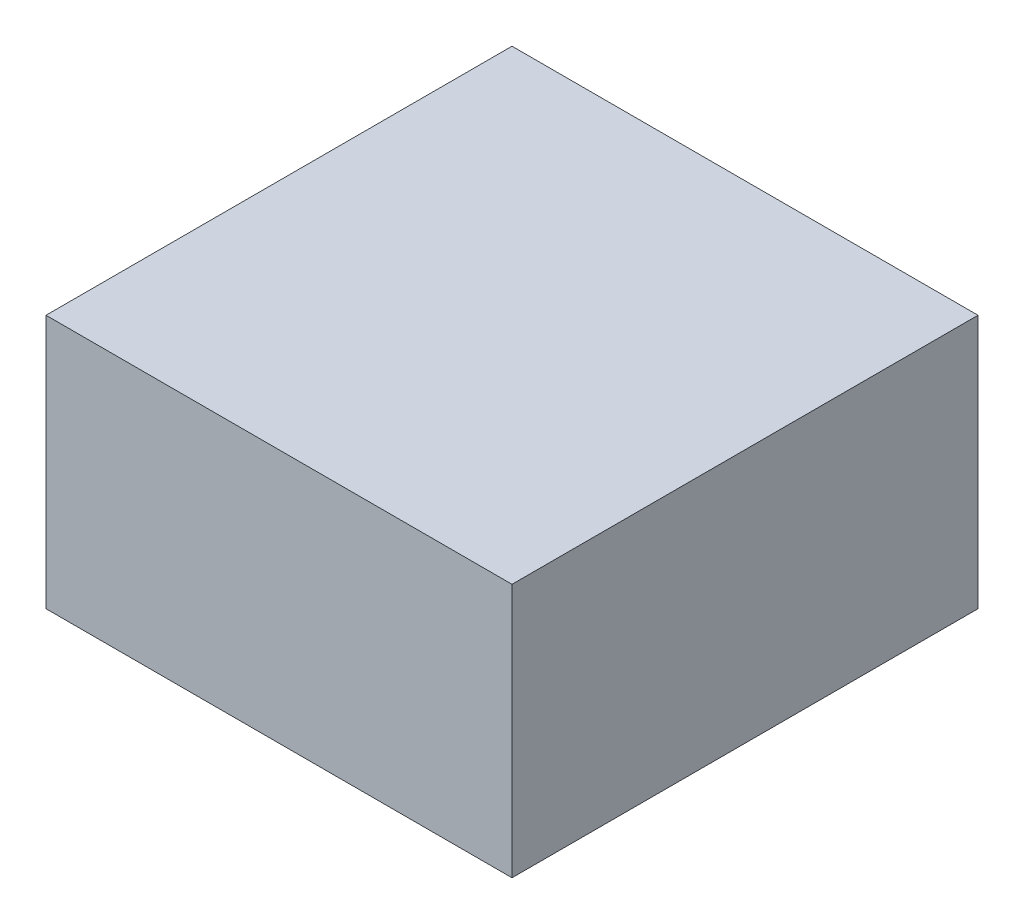
ISO-10303-21;
HEADER;
FILE_DESCRIPTION(('STEP AP214'),'2;1');
FILE_NAME('part.step','',(''),(''),'','','');
FILE_SCHEMA(('AUTOMOTIVE_DESIGN { 1 0 10303 214 1 1 1 1 }'));
ENDSEC;
DATA;
#1=APPLICATION_CONTEXT('core data for automotive mechanical design processes');
#2=APPLICATION_PROTOCOL_DEFINITION('international standard','automotive_design',2000,#1);
#3=PRODUCT_CONTEXT('',#1,'mechanical');
#4=PRODUCT('Part','Part','',(#3));
#5=PRODUCT_RELATED_PRODUCT_CATEGORY('part','',(#4));
#6=PRODUCT_DEFINITION_FORMATION('','',#4);
#7=PRODUCT_DEFINITION_CONTEXT('part definition',#1,'design');
#8=PRODUCT_DEFINITION('design','',#6,#7);
#9=PRODUCT_DEFINITION_SHAPE('','',#8);
#10=(LENGTH_UNIT() NAMED_UNIT(*) SI_UNIT(.MILLI.,.METRE.));
#11=(NAMED_UNIT(*) PLANE_ANGLE_UNIT() SI_UNIT($,.RADIAN.));
#12=(NAMED_UNIT(*) SI_UNIT($,.STERADIAN.) SOLID_ANGLE_UNIT());
#13=UNCERTAINTY_MEASURE_WITH_UNIT(LENGTH_MEASURE(1.E-05),#10,'distance_accuracy_value','');
#14=(GEOMETRIC_REPRESENTATION_CONTEXT(3) GLOBAL_UNCERTAINTY_ASSIGNED_CONTEXT((#13)) GLOBAL_UNIT_ASSIGNED_CONTEXT((#10,
#11,#12)) REPRESENTATION_CONTEXT('',''));
#15=CARTESIAN_POINT('',(0.,0.,0.));
#16=DIRECTION('',(0.,0.,1.));
#17=DIRECTION('',(1.,0.,0.));
#18=AXIS2_PLACEMENT_3D('',#15,#16,#17);
#19=CARTESIAN_POINT('',(0.,-120.,0.));
#20=DIRECTION('',(-1.,0.,0.));
#21=DIRECTION('',(0.,0.,1.));
#22=AXIS2_PLACEMENT_3D('',#19,#20,#21);
#23=PLANE('',#22);
#24=DIRECTION('',(0.,0.,1.));
#25=VECTOR('',#24,1.);
#26=CARTESIAN_POINT('',(0.,0.,0.));
#27=LINE('',#26,#25);
#28=CARTESIAN_POINT('',(0.,0.,-220.));
#29=VERTEX_POINT('',#28);
#30=CARTESIAN_POINT('',(0.,0.,0.));
#31=VERTEX_POINT('',#30);
#32=EDGE_CURVE('E97',#29,#31,#27,.T.);
#33=ORIENTED_EDGE('',*,*,#32,.F.);
#34=DIRECTION('',(0.,1.,0.));
#35=VECTOR('',#34,1.);
#36=CARTESIAN_POINT('',(0.,-120.,-220.));
#37=LINE('',#36,#35);
#38=CARTESIAN_POINT('',(0.,-120.,-220.));
#39=VERTEX_POINT('',#38);
#40=EDGE_CURVE('E11',#39,#29,#37,.T.);
#41=ORIENTED_EDGE('',*,*,#40,.F.);
#42=DIRECTION('',(0.,0.,1.));
#43=VECTOR('',#42,1.);
#44=CARTESIAN_POINT('',(0.,-120.,0.));
#45=LINE('',#44,#43);
#46=CARTESIAN_POINT('',(0.,-120.,0.));
#47=VERTEX_POINT('',#46);
#48=EDGE_CURVE('E91',#39,#47,#45,.T.);
#49=ORIENTED_EDGE('',*,*,#48,.T.);
#50=DIRECTION('',(0.,1.,0.));
#51=VECTOR('',#50,1.);
#52=CARTESIAN_POINT('',(0.,-120.,0.));
#53=LINE('',#52,#51);
#54=EDGE_CURVE('E36',#47,#31,#53,.T.);
#55=ORIENTED_EDGE('',*,*,#54,.T.);
#56=EDGE_LOOP('',(#33,#41,#49,#55));
#57=FACE_BOUND('',#56,.T.);
#58=ADVANCED_FACE('F33',(#57),#23,.T.);
#59=CARTESIAN_POINT('',(0.,-120.,-220.));
#60=DIRECTION('',(0.,0.,-1.));
#61=DIRECTION('',(-1.,0.,0.));
#62=AXIS2_PLACEMENT_3D('',#59,#60,#61);
#63=PLANE('',#62);
#64=DIRECTION('',(-1.,0.,0.));
#65=VECTOR('',#64,1.);
#66=CARTESIAN_POINT('',(0.,0.,-220.));
#67=LINE('',#66,#65);
#68=CARTESIAN_POINT('',(220.,0.,-220.));
#69=VERTEX_POINT('',#68);
#70=EDGE_CURVE('E93',#69,#29,#67,.T.);
#71=ORIENTED_EDGE('',*,*,#70,.F.);
#72=DIRECTION('',(0.,1.,0.));
#73=VECTOR('',#72,1.);
#74=CARTESIAN_POINT('',(220.,-120.,-220.));
#75=LINE('',#74,#73);
#76=CARTESIAN_POINT('',(220.,-120.,-220.));
#77=VERTEX_POINT('',#76);
#78=EDGE_CURVE('E42',#77,#69,#75,.T.);
#79=ORIENTED_EDGE('',*,*,#78,.F.);
#80=DIRECTION('',(-1.,0.,0.));
#81=VECTOR('',#80,1.);
#82=CARTESIAN_POINT('',(0.,-120.,-220.));
#83=LINE('',#82,#81);
#84=EDGE_CURVE('E88',#77,#39,#83,.T.);
#85=ORIENTED_EDGE('',*,*,#84,.T.);
#86=ORIENTED_EDGE('',*,*,#40,.T.);
#87=EDGE_LOOP('',(#71,#79,#85,#86));
#88=FACE_BOUND('',#87,.T.);
#89=ADVANCED_FACE('F107',(#88),#63,.T.);
#90=CARTESIAN_POINT('',(220.,-120.,0.));
#91=DIRECTION('',(1.,0.,0.));
#92=DIRECTION('',(0.,0.,-1.));
#93=AXIS2_PLACEMENT_3D('',#90,#91,#92);
#94=PLANE('',#93);
#95=DIRECTION('',(0.,0.,-1.));
#96=VECTOR('',#95,1.);
#97=CARTESIAN_POINT('',(220.,0.,0.));
#98=LINE('',#97,#96);
#99=CARTESIAN_POINT('',(220.,0.,0.));
#100=VERTEX_POINT('',#99);
#101=EDGE_CURVE('E83',#100,#69,#98,.T.);
#102=ORIENTED_EDGE('',*,*,#101,.F.);
#103=DIRECTION('',(0.,1.,0.));
#104=VECTOR('',#103,1.);
#105=CARTESIAN_POINT('',(220.,-120.,0.));
#106=LINE('',#105,#104);
#107=CARTESIAN_POINT('',(220.,-120.,0.));
#108=VERTEX_POINT('',#107);
#109=EDGE_CURVE('E78',#108,#100,#106,.T.);
#110=ORIENTED_EDGE('',*,*,#109,.F.);
#111=DIRECTION('',(0.,0.,-1.));
#112=VECTOR('',#111,1.);
#113=CARTESIAN_POINT('',(220.,-120.,0.));
#114=LINE('',#113,#112);
#115=EDGE_CURVE('E81',#108,#77,#114,.T.);
#116=ORIENTED_EDGE('',*,*,#115,.T.);
#117=ORIENTED_EDGE('',*,*,#78,.T.);
#118=EDGE_LOOP('',(#102,#110,#116,#117));
#119=FACE_BOUND('',#118,.T.);
#120=ADVANCED_FACE('F80',(#119),#94,.T.);
#121=CARTESIAN_POINT('',(0.,-120.,0.));
#122=DIRECTION('',(0.,0.,1.));
#123=DIRECTION('',(1.,0.,0.));
#124=AXIS2_PLACEMENT_3D('',#121,#122,#123);
#125=PLANE('',#124);
#126=DIRECTION('',(1.,0.,0.));
#127=VECTOR('',#126,1.);
#128=CARTESIAN_POINT('',(0.,0.,0.));
#129=LINE('',#128,#127);
#130=EDGE_CURVE('E100',#31,#100,#129,.T.);
#131=ORIENTED_EDGE('',*,*,#130,.F.);
#132=ORIENTED_EDGE('',*,*,#54,.F.);
#133=DIRECTION('',(1.,0.,0.));
#134=VECTOR('',#133,1.);
#135=CARTESIAN_POINT('',(0.,-120.,0.));
#136=LINE('',#135,#134);
#137=EDGE_CURVE('E87',#47,#108,#136,.T.);
#138=ORIENTED_EDGE('',*,*,#137,.T.);
#139=ORIENTED_EDGE('',*,*,#109,.T.);
#140=EDGE_LOOP('',(#131,#132,#138,#139));
#141=FACE_BOUND('',#140,.T.);
#142=ADVANCED_FACE('F90',(#141),#125,.T.);
#143=CARTESIAN_POINT('',(0.,-120.,0.));
#144=DIRECTION('',(0.,-1.,0.));
#145=DIRECTION('',(0.,0.,-1.));
#146=AXIS2_PLACEMENT_3D('',#143,#144,#145);
#147=PLANE('',#146);
#148=ORIENTED_EDGE('',*,*,#48,.F.);
#149=ORIENTED_EDGE('',*,*,#84,.F.);
#150=ORIENTED_EDGE('',*,*,#115,.F.);
#151=ORIENTED_EDGE('',*,*,#137,.F.);
#152=EDGE_LOOP('',(#148,#149,#150,#151));
#153=FACE_BOUND('',#152,.T.);
#154=ADVANCED_FACE('F86',(#153),#147,.T.);
#155=CARTESIAN_POINT('',(0.,0.,0.));
#156=DIRECTION('',(0.,-1.,0.));
#157=DIRECTION('',(0.,0.,-1.));
#158=AXIS2_PLACEMENT_3D('',#155,#156,#157);
#159=PLANE('',#158);
#160=ORIENTED_EDGE('',*,*,#32,.T.);
#161=ORIENTED_EDGE('',*,*,#130,.T.);
#162=ORIENTED_EDGE('',*,*,#101,.T.);
#163=ORIENTED_EDGE('',*,*,#70,.T.);
#164=EDGE_LOOP('',(#160,#161,#162,#163));
#165=FACE_BOUND('',#164,.T.);
#166=ADVANCED_FACE('F106',(#165),#159,.F.);
#167=CLOSED_SHELL('',(#58,#89,#120,#142,#154,#166));
#168=MANIFOLD_SOLID_BREP('B2',#167);
#169=ADVANCED_BREP_SHAPE_REPRESENTATION('',(#18,#168),#14);
#170=SHAPE_DEFINITION_REPRESENTATION(#9,#169);
ENDSEC;
END-ISO-10303-21;
